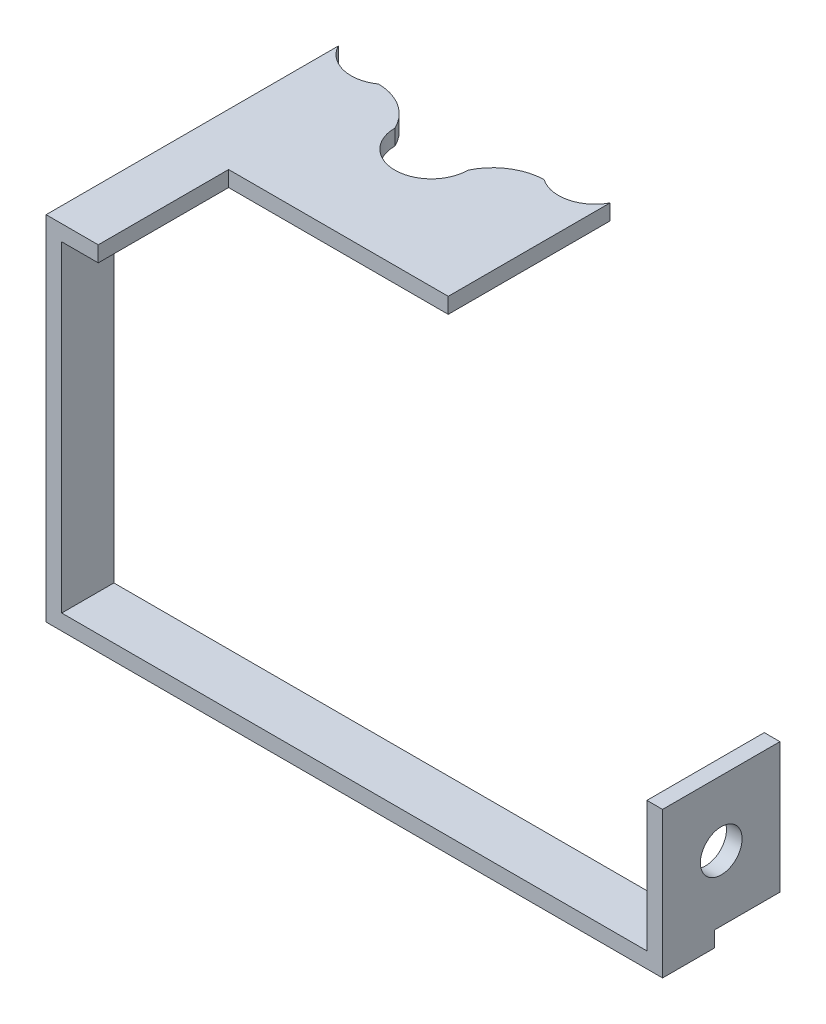
ISO-10303-21;
HEADER;
FILE_DESCRIPTION(('STEP AP214'),'2;1');
FILE_NAME('part.step','',(''),(''),'','','');
FILE_SCHEMA(('AUTOMOTIVE_DESIGN { 1 0 10303 214 1 1 1 1 }'));
ENDSEC;
DATA;
#1=APPLICATION_CONTEXT('core data for automotive mechanical design processes');
#2=APPLICATION_PROTOCOL_DEFINITION('international standard','automotive_design',2000,#1);
#3=PRODUCT_CONTEXT('',#1,'mechanical');
#4=PRODUCT('Part','Part','',(#3));
#5=PRODUCT_RELATED_PRODUCT_CATEGORY('part','',(#4));
#6=PRODUCT_DEFINITION_FORMATION('','',#4);
#7=PRODUCT_DEFINITION_CONTEXT('part definition',#1,'design');
#8=PRODUCT_DEFINITION('design','',#6,#7);
#9=PRODUCT_DEFINITION_SHAPE('','',#8);
#10=(LENGTH_UNIT() NAMED_UNIT(*) SI_UNIT(.MILLI.,.METRE.));
#11=(NAMED_UNIT(*) PLANE_ANGLE_UNIT() SI_UNIT($,.RADIAN.));
#12=(NAMED_UNIT(*) SI_UNIT($,.STERADIAN.) SOLID_ANGLE_UNIT());
#13=UNCERTAINTY_MEASURE_WITH_UNIT(LENGTH_MEASURE(1.E-05),#10,'distance_accuracy_value','');
#14=(GEOMETRIC_REPRESENTATION_CONTEXT(3) GLOBAL_UNCERTAINTY_ASSIGNED_CONTEXT((#13)) GLOBAL_UNIT_ASSIGNED_CONTEXT((#10,
#11,#12)) REPRESENTATION_CONTEXT('',''));
#15=CARTESIAN_POINT('',(0.,0.,0.));
#16=DIRECTION('',(0.,0.,1.));
#17=DIRECTION('',(1.,0.,0.));
#18=AXIS2_PLACEMENT_3D('',#15,#16,#17);
#19=CARTESIAN_POINT('',(92.1564308814646,-61.65,47.8349535593541));
#20=DIRECTION('',(0.,-1.,0.));
#21=DIRECTION('',(0.,0.,-1.));
#22=AXIS2_PLACEMENT_3D('',#19,#20,#21);
#23=PLANE('',#22);
#24=DIRECTION('',(0.,0.,1.));
#25=VECTOR('',#24,1.);
#26=CARTESIAN_POINT('',(89.1564308814646,-61.65,47.8349535593541));
#27=LINE('',#26,#25);
#28=CARTESIAN_POINT('',(89.1564308814646,-61.65,37.8349535593541));
#29=VERTEX_POINT('',#28);
#30=CARTESIAN_POINT('',(89.1564308814646,-61.65,47.8349535593541));
#31=VERTEX_POINT('',#30);
#32=EDGE_CURVE('E366',#29,#31,#27,.T.);
#33=ORIENTED_EDGE('',*,*,#32,.F.);
#34=DIRECTION('',(-1.,0.,0.));
#35=VECTOR('',#34,1.);
#36=CARTESIAN_POINT('',(92.1564308814646,-61.65,37.8349535593541));
#37=LINE('',#36,#35);
#38=CARTESIAN_POINT('',(-23.0555691185354,-61.65,37.8349535593541));
#39=VERTEX_POINT('',#38);
#40=EDGE_CURVE('E211',#29,#39,#37,.T.);
#41=ORIENTED_EDGE('',*,*,#40,.T.);
#42=DIRECTION('',(0.,0.,1.));
#43=VECTOR('',#42,1.);
#44=CARTESIAN_POINT('',(-23.0555691185354,-61.65,47.8349535593541));
#45=LINE('',#44,#43);
#46=CARTESIAN_POINT('',(-23.0555691185354,-61.65,47.8349535593541));
#47=VERTEX_POINT('',#46);
#48=EDGE_CURVE('E195',#39,#47,#45,.T.);
#49=ORIENTED_EDGE('',*,*,#48,.T.);
#50=DIRECTION('',(-1.,0.,0.));
#51=VECTOR('',#50,1.);
#52=CARTESIAN_POINT('',(92.1564308814646,-61.65,47.8349535593541));
#53=LINE('',#52,#51);
#54=EDGE_CURVE('E208',#31,#47,#53,.T.);
#55=ORIENTED_EDGE('',*,*,#54,.F.);
#56=EDGE_LOOP('',(#33,#41,#49,#55));
#57=FACE_BOUND('',#56,.T.);
#58=ADVANCED_FACE('F39',(#57),#23,.F.);
#59=CARTESIAN_POINT('',(-23.0555691185354,-64.65,47.8349535593541));
#60=DIRECTION('',(-1.,0.,0.));
#61=DIRECTION('',(0.,0.,1.));
#62=AXIS2_PLACEMENT_3D('',#59,#60,#61);
#63=PLANE('',#62);
#64=ORIENTED_EDGE('',*,*,#48,.F.);
#65=DIRECTION('',(0.,1.,0.));
#66=VECTOR('',#65,1.);
#67=CARTESIAN_POINT('',(-23.0555691185354,-64.65,37.8349535593541));
#68=LINE('',#67,#66);
#69=CARTESIAN_POINT('',(-23.0555691185354,0.,37.8349535593541));
#70=VERTEX_POINT('',#69);
#71=EDGE_CURVE('E226',#39,#70,#68,.T.);
#72=ORIENTED_EDGE('',*,*,#71,.T.);
#73=DIRECTION('',(0.,0.,1.));
#74=VECTOR('',#73,1.);
#75=CARTESIAN_POINT('',(-23.0555691185354,0.,47.8349535593541));
#76=LINE('',#75,#74);
#77=CARTESIAN_POINT('',(-23.0555691185354,0.,47.8349535593541));
#78=VERTEX_POINT('',#77);
#79=EDGE_CURVE('E218',#70,#78,#76,.T.);
#80=ORIENTED_EDGE('',*,*,#79,.T.);
#81=DIRECTION('',(0.,1.,0.));
#82=VECTOR('',#81,1.);
#83=CARTESIAN_POINT('',(-23.0555691185354,-64.65,47.8349535593541));
#84=LINE('',#83,#82);
#85=EDGE_CURVE('E62',#47,#78,#84,.T.);
#86=ORIENTED_EDGE('',*,*,#85,.F.);
#87=EDGE_LOOP('',(#64,#72,#80,#86));
#88=FACE_BOUND('',#87,.T.);
#89=ADVANCED_FACE('F347',(#88),#63,.F.);
#90=CARTESIAN_POINT('',(16.0451571243017,0.,4.26440295899608));
#91=DIRECTION('',(0.,1.,0.));
#92=DIRECTION('',(0.,0.,1.));
#93=AXIS2_PLACEMENT_3D('',#90,#91,#92);
#94=PLANE('',#93);
#95=ORIENTED_EDGE('',*,*,#79,.F.);
#96=DIRECTION('',(1.,0.,0.));
#97=VECTOR('',#96,1.);
#98=CARTESIAN_POINT('',(-26.0555691185354,0.,37.8349535593541));
#99=LINE('',#98,#97);
#100=CARTESIAN_POINT('',(-26.0555691185354,0.,37.8349535593541));
#101=VERTEX_POINT('',#100);
#102=EDGE_CURVE('E54',#101,#70,#99,.T.);
#103=ORIENTED_EDGE('',*,*,#102,.F.);
#104=DIRECTION('',(0.,0.,1.));
#105=VECTOR('',#104,1.);
#106=CARTESIAN_POINT('',(-26.0555691185354,0.,22.8349535593541));
#107=LINE('',#106,#105);
#108=CARTESIAN_POINT('',(-26.0555691185354,0.,-8.18804644064587));
#109=VERTEX_POINT('',#108);
#110=EDGE_CURVE('E277',#109,#101,#107,.T.);
#111=ORIENTED_EDGE('',*,*,#110,.F.);
#112=CARTESIAN_POINT('',(-19.8752830168529,0.,-11.4749999999999));
#113=DIRECTION('',(0.,-1.,0.));
#114=DIRECTION('',(0.,0.,-1.));
#115=AXIS2_PLACEMENT_3D('',#112,#113,#114);
#116=CIRCLE('',#115,7.);
#117=CARTESIAN_POINT('',(-15.8700792263388,0.,-5.73406431002294));
#118=VERTEX_POINT('',#117);
#119=EDGE_CURVE('E275',#118,#109,#116,.T.);
#120=ORIENTED_EDGE('',*,*,#119,.F.);
#121=CARTESIAN_POINT('',(-16.0451571243017,0.,4.26440295899608));
#122=DIRECTION('',(0.,1.,0.));
#123=DIRECTION('',(0.,0.,1.));
#124=AXIS2_PLACEMENT_3D('',#121,#122,#123);
#125=CIRCLE('',#124,9.99999999999999);
#126=CARTESIAN_POINT('',(-7.,0.,0.));
#127=VERTEX_POINT('',#126);
#128=EDGE_CURVE('E273',#127,#118,#125,.T.);
#129=ORIENTED_EDGE('',*,*,#128,.F.);
#130=CARTESIAN_POINT('',(0.,0.,0.));
#131=DIRECTION('',(0.,-1.,0.));
#132=DIRECTION('',(0.,0.,-1.));
#133=AXIS2_PLACEMENT_3D('',#130,#131,#132);
#134=CIRCLE('',#133,7.);
#135=CARTESIAN_POINT('',(7.,0.,0.));
#136=VERTEX_POINT('',#135);
#137=EDGE_CURVE('E271',#136,#127,#134,.T.);
#138=ORIENTED_EDGE('',*,*,#137,.F.);
#139=CARTESIAN_POINT('',(16.0451571243017,0.,4.26440295899608));
#140=DIRECTION('',(0.,1.,0.));
#141=DIRECTION('',(0.,0.,1.));
#142=AXIS2_PLACEMENT_3D('',#139,#140,#141);
#143=CIRCLE('',#142,10.);
#144=CARTESIAN_POINT('',(15.8700792263388,0.,-5.73406431002295));
#145=VERTEX_POINT('',#144);
#146=EDGE_CURVE('E249',#145,#136,#143,.T.);
#147=ORIENTED_EDGE('',*,*,#146,.F.);
#148=CARTESIAN_POINT('',(19.8752830168529,0.,-11.4749999999999));
#149=DIRECTION('',(0.,-1.,0.));
#150=DIRECTION('',(0.,0.,1.));
#151=AXIS2_PLACEMENT_3D('',#148,#149,#150);
#152=CIRCLE('',#151,7.);
#153=CARTESIAN_POINT('',(26.0555691185354,0.,-8.18804644064582));
#154=VERTEX_POINT('',#153);
#155=EDGE_CURVE('E254',#154,#145,#152,.T.);
#156=ORIENTED_EDGE('',*,*,#155,.F.);
#157=DIRECTION('',(0.,0.,-1.));
#158=VECTOR('',#157,1.);
#159=CARTESIAN_POINT('',(26.0555691185354,0.,-8.18804644064582));
#160=LINE('',#159,#158);
#161=CARTESIAN_POINT('',(26.0555691185354,0.,22.8349535593541));
#162=VERTEX_POINT('',#161);
#163=EDGE_CURVE('E281',#162,#154,#160,.T.);
#164=ORIENTED_EDGE('',*,*,#163,.F.);
#165=DIRECTION('',(1.,0.,0.));
#166=VECTOR('',#165,1.);
#167=CARTESIAN_POINT('',(-26.0555691185354,0.,22.8349535593541));
#168=LINE('',#167,#166);
#169=CARTESIAN_POINT('',(-16.0555691185354,0.,22.8349535593541));
#170=VERTEX_POINT('',#169);
#171=EDGE_CURVE('E279',#170,#162,#168,.T.);
#172=ORIENTED_EDGE('',*,*,#171,.F.);
#173=DIRECTION('',(0.,0.,-1.));
#174=VECTOR('',#173,1.);
#175=CARTESIAN_POINT('',(-16.0555691185354,0.,47.8349535593541));
#176=LINE('',#175,#174);
#177=CARTESIAN_POINT('',(-16.0555691185354,0.,47.8349535593541));
#178=VERTEX_POINT('',#177);
#179=EDGE_CURVE('E246',#178,#170,#176,.T.);
#180=ORIENTED_EDGE('',*,*,#179,.F.);
#181=DIRECTION('',(1.,0.,0.));
#182=VECTOR('',#181,1.);
#183=CARTESIAN_POINT('',(-26.0555691185354,0.,47.8349535593541));
#184=LINE('',#183,#182);
#185=EDGE_CURVE('E237',#78,#178,#184,.T.);
#186=ORIENTED_EDGE('',*,*,#185,.F.);
#187=EDGE_LOOP('',(#95,#103,#111,#120,#129,#138,#147,#156,#164,#172,#180,#186));
#188=FACE_BOUND('',#187,.T.);
#189=ADVANCED_FACE('F306',(#188),#94,.F.);
#190=CARTESIAN_POINT('',(-26.0555691185354,3.,22.8349535593541));
#191=DIRECTION('',(0.,0.,-1.));
#192=DIRECTION('',(-1.,0.,0.));
#193=AXIS2_PLACEMENT_3D('',#190,#191,#192);
#194=PLANE('',#193);
#195=DIRECTION('',(0.,1.,0.));
#196=VECTOR('',#195,1.);
#197=CARTESIAN_POINT('',(-16.0555691185354,3.,22.8349535593541));
#198=LINE('',#197,#196);
#199=CARTESIAN_POINT('',(-16.0555691185354,3.,22.8349535593541));
#200=VERTEX_POINT('',#199);
#201=EDGE_CURVE('E231',#170,#200,#198,.T.);
#202=ORIENTED_EDGE('',*,*,#201,.F.);
#203=ORIENTED_EDGE('',*,*,#171,.T.);
#204=DIRECTION('',(0.,-1.,0.));
#205=VECTOR('',#204,1.);
#206=CARTESIAN_POINT('',(26.0555691185354,3.,22.8349535593541));
#207=LINE('',#206,#205);
#208=CARTESIAN_POINT('',(26.0555691185354,3.,22.8349535593541));
#209=VERTEX_POINT('',#208);
#210=EDGE_CURVE('E289',#209,#162,#207,.T.);
#211=ORIENTED_EDGE('',*,*,#210,.F.);
#212=DIRECTION('',(1.,0.,0.));
#213=VECTOR('',#212,1.);
#214=CARTESIAN_POINT('',(-26.0555691185354,3.,22.8349535593541));
#215=LINE('',#214,#213);
#216=EDGE_CURVE('E262',#200,#209,#215,.T.);
#217=ORIENTED_EDGE('',*,*,#216,.F.);
#218=EDGE_LOOP('',(#202,#203,#211,#217));
#219=FACE_BOUND('',#218,.T.);
#220=ADVANCED_FACE('F338',(#219),#194,.F.);
#221=CARTESIAN_POINT('',(16.0451571243017,3.,4.26440295899608));
#222=DIRECTION('',(0.,-1.,0.));
#223=DIRECTION('',(0.,0.,-1.));
#224=AXIS2_PLACEMENT_3D('',#221,#222,#223);
#225=CYLINDRICAL_SURFACE('',#224,10.);
#226=ORIENTED_EDGE('',*,*,#146,.T.);
#227=DIRECTION('',(0.,-1.,0.));
#228=VECTOR('',#227,1.);
#229=CARTESIAN_POINT('',(7.,3.,0.));
#230=LINE('',#229,#228);
#231=CARTESIAN_POINT('',(7.,3.,0.));
#232=VERTEX_POINT('',#231);
#233=EDGE_CURVE('E11',#232,#136,#230,.T.);
#234=ORIENTED_EDGE('',*,*,#233,.F.);
#235=CARTESIAN_POINT('',(16.0451571243017,3.,4.26440295899608));
#236=DIRECTION('',(0.,1.,0.));
#237=DIRECTION('',(0.,0.,1.));
#238=AXIS2_PLACEMENT_3D('',#235,#236,#237);
#239=CIRCLE('',#238,10.);
#240=CARTESIAN_POINT('',(15.8700792263388,3.,-5.73406431002295));
#241=VERTEX_POINT('',#240);
#242=EDGE_CURVE('E250',#241,#232,#239,.T.);
#243=ORIENTED_EDGE('',*,*,#242,.F.);
#244=DIRECTION('',(0.,-1.,0.));
#245=VECTOR('',#244,1.);
#246=CARTESIAN_POINT('',(15.8700792263388,3.,-5.73406431002295));
#247=LINE('',#246,#245);
#248=EDGE_CURVE('E268',#241,#145,#247,.T.);
#249=ORIENTED_EDGE('',*,*,#248,.T.);
#250=EDGE_LOOP('',(#226,#234,#243,#249));
#251=FACE_BOUND('',#250,.T.);
#252=ADVANCED_FACE('F41',(#251),#225,.T.);
#253=CARTESIAN_POINT('',(0.,3.,0.));
#254=DIRECTION('',(0.,-1.,0.));
#255=DIRECTION('',(0.,0.,-1.));
#256=AXIS2_PLACEMENT_3D('',#253,#254,#255);
#257=CYLINDRICAL_SURFACE('',#256,7.);
#258=ORIENTED_EDGE('',*,*,#137,.T.);
#259=DIRECTION('',(0.,-1.,0.));
#260=VECTOR('',#259,1.);
#261=CARTESIAN_POINT('',(-7.,3.,0.));
#262=LINE('',#261,#260);
#263=CARTESIAN_POINT('',(-7.,3.,0.));
#264=VERTEX_POINT('',#263);
#265=EDGE_CURVE('E47',#264,#127,#262,.T.);
#266=ORIENTED_EDGE('',*,*,#265,.F.);
#267=CARTESIAN_POINT('',(0.,3.,0.));
#268=DIRECTION('',(0.,-1.,0.));
#269=DIRECTION('',(0.,0.,-1.));
#270=AXIS2_PLACEMENT_3D('',#267,#268,#269);
#271=CIRCLE('',#270,7.);
#272=EDGE_CURVE('E253',#232,#264,#271,.T.);
#273=ORIENTED_EDGE('',*,*,#272,.F.);
#274=ORIENTED_EDGE('',*,*,#233,.T.);
#275=EDGE_LOOP('',(#258,#266,#273,#274));
#276=FACE_BOUND('',#275,.T.);
#277=ADVANCED_FACE('F323',(#276),#257,.F.);
#278=CARTESIAN_POINT('',(-16.0451571243017,3.,4.26440295899608));
#279=DIRECTION('',(0.,-1.,0.));
#280=DIRECTION('',(0.,0.,-1.));
#281=AXIS2_PLACEMENT_3D('',#278,#279,#280);
#282=CYLINDRICAL_SURFACE('',#281,9.99999999999999);
#283=ORIENTED_EDGE('',*,*,#128,.T.);
#284=DIRECTION('',(0.,-1.,0.));
#285=VECTOR('',#284,1.);
#286=CARTESIAN_POINT('',(-15.8700792263388,3.,-5.73406431002294));
#287=LINE('',#286,#285);
#288=CARTESIAN_POINT('',(-15.8700792263388,3.,-5.73406431002294));
#289=VERTEX_POINT('',#288);
#290=EDGE_CURVE('E295',#289,#118,#287,.T.);
#291=ORIENTED_EDGE('',*,*,#290,.F.);
#292=CARTESIAN_POINT('',(-16.0451571243017,3.,4.26440295899608));
#293=DIRECTION('',(0.,1.,0.));
#294=DIRECTION('',(0.,0.,1.));
#295=AXIS2_PLACEMENT_3D('',#292,#293,#294);
#296=CIRCLE('',#295,9.99999999999999);
#297=EDGE_CURVE('E256',#264,#289,#296,.T.);
#298=ORIENTED_EDGE('',*,*,#297,.F.);
#299=ORIENTED_EDGE('',*,*,#265,.T.);
#300=EDGE_LOOP('',(#283,#291,#298,#299));
#301=FACE_BOUND('',#300,.T.);
#302=ADVANCED_FACE('F302',(#301),#282,.T.);
#303=CARTESIAN_POINT('',(-19.8752830168529,3.,-11.4749999999999));
#304=DIRECTION('',(0.,-1.,0.));
#305=DIRECTION('',(0.,0.,-1.));
#306=AXIS2_PLACEMENT_3D('',#303,#304,#305);
#307=CYLINDRICAL_SURFACE('',#306,7.);
#308=ORIENTED_EDGE('',*,*,#119,.T.);
#309=DIRECTION('',(0.,-1.,0.));
#310=VECTOR('',#309,1.);
#311=CARTESIAN_POINT('',(-26.0555691185354,3.,-8.18804644064587));
#312=LINE('',#311,#310);
#313=CARTESIAN_POINT('',(-26.0555691185354,3.,-8.18804644064587));
#314=VERTEX_POINT('',#313);
#315=EDGE_CURVE('E292',#314,#109,#312,.T.);
#316=ORIENTED_EDGE('',*,*,#315,.F.);
#317=CARTESIAN_POINT('',(-19.8752830168529,3.,-11.4749999999999));
#318=DIRECTION('',(0.,-1.,0.));
#319=DIRECTION('',(0.,0.,-1.));
#320=AXIS2_PLACEMENT_3D('',#317,#318,#319);
#321=CIRCLE('',#320,7.);
#322=EDGE_CURVE('E258',#289,#314,#321,.T.);
#323=ORIENTED_EDGE('',*,*,#322,.F.);
#324=ORIENTED_EDGE('',*,*,#290,.T.);
#325=EDGE_LOOP('',(#308,#316,#323,#324));
#326=FACE_BOUND('',#325,.T.);
#327=ADVANCED_FACE('F310',(#326),#307,.F.);
#328=CARTESIAN_POINT('',(-26.0555691185354,3.,22.8349535593541));
#329=DIRECTION('',(1.,0.,0.));
#330=DIRECTION('',(0.,0.,-1.));
#331=AXIS2_PLACEMENT_3D('',#328,#329,#330);
#332=PLANE('',#331);
#333=ORIENTED_EDGE('',*,*,#110,.T.);
#334=DIRECTION('',(0.,1.,0.));
#335=VECTOR('',#334,1.);
#336=CARTESIAN_POINT('',(-26.0555691185354,-64.65,37.8349535593541));
#337=LINE('',#336,#335);
#338=CARTESIAN_POINT('',(-26.0555691185354,-64.65,37.8349535593541));
#339=VERTEX_POINT('',#338);
#340=EDGE_CURVE('E228',#339,#101,#337,.T.);
#341=ORIENTED_EDGE('',*,*,#340,.F.);
#342=DIRECTION('',(0.,0.,-1.));
#343=VECTOR('',#342,1.);
#344=CARTESIAN_POINT('',(-26.0555691185354,-64.65,47.8349535593541));
#345=LINE('',#344,#343);
#346=CARTESIAN_POINT('',(-26.0555691185354,-64.65,47.8349535593541));
#347=VERTEX_POINT('',#346);
#348=EDGE_CURVE('E217',#347,#339,#345,.T.);
#349=ORIENTED_EDGE('',*,*,#348,.F.);
#350=DIRECTION('',(0.,-1.,0.));
#351=VECTOR('',#350,1.);
#352=CARTESIAN_POINT('',(-26.0555691185354,3.,47.8349535593541));
#353=LINE('',#352,#351);
#354=CARTESIAN_POINT('',(-26.0555691185354,3.,47.8349535593541));
#355=VERTEX_POINT('',#354);
#356=EDGE_CURVE('E235',#355,#347,#353,.T.);
#357=ORIENTED_EDGE('',*,*,#356,.F.);
#358=DIRECTION('',(0.,0.,1.));
#359=VECTOR('',#358,1.);
#360=CARTESIAN_POINT('',(-26.0555691185354,3.,22.8349535593541));
#361=LINE('',#360,#359);
#362=EDGE_CURVE('E260',#314,#355,#361,.T.);
#363=ORIENTED_EDGE('',*,*,#362,.F.);
#364=ORIENTED_EDGE('',*,*,#315,.T.);
#365=EDGE_LOOP('',(#333,#341,#349,#357,#363,#364));
#366=FACE_BOUND('',#365,.T.);
#367=ADVANCED_FACE('F314',(#366),#332,.F.);
#368=CARTESIAN_POINT('',(26.0555691185354,3.,-8.18804644064582));
#369=DIRECTION('',(-1.,0.,0.));
#370=DIRECTION('',(0.,0.,1.));
#371=AXIS2_PLACEMENT_3D('',#368,#369,#370);
#372=PLANE('',#371);
#373=ORIENTED_EDGE('',*,*,#163,.T.);
#374=DIRECTION('',(0.,-1.,0.));
#375=VECTOR('',#374,1.);
#376=CARTESIAN_POINT('',(26.0555691185354,3.,-8.18804644064582));
#377=LINE('',#376,#375);
#378=CARTESIAN_POINT('',(26.0555691185354,3.,-8.18804644064582));
#379=VERTEX_POINT('',#378);
#380=EDGE_CURVE('E286',#379,#154,#377,.T.);
#381=ORIENTED_EDGE('',*,*,#380,.F.);
#382=DIRECTION('',(0.,0.,-1.));
#383=VECTOR('',#382,1.);
#384=CARTESIAN_POINT('',(26.0555691185354,3.,-8.18804644064582));
#385=LINE('',#384,#383);
#386=EDGE_CURVE('E264',#209,#379,#385,.T.);
#387=ORIENTED_EDGE('',*,*,#386,.F.);
#388=ORIENTED_EDGE('',*,*,#210,.T.);
#389=EDGE_LOOP('',(#373,#381,#387,#388));
#390=FACE_BOUND('',#389,.T.);
#391=ADVANCED_FACE('F335',(#390),#372,.F.);
#392=CARTESIAN_POINT('',(19.8752830168529,3.,-11.4749999999999));
#393=DIRECTION('',(0.,-1.,0.));
#394=DIRECTION('',(0.,0.,-1.));
#395=AXIS2_PLACEMENT_3D('',#392,#393,#394);
#396=CYLINDRICAL_SURFACE('',#395,7.);
#397=ORIENTED_EDGE('',*,*,#155,.T.);
#398=ORIENTED_EDGE('',*,*,#248,.F.);
#399=CARTESIAN_POINT('',(19.8752830168529,3.,-11.4749999999999));
#400=DIRECTION('',(0.,-1.,0.));
#401=DIRECTION('',(0.,0.,1.));
#402=AXIS2_PLACEMENT_3D('',#399,#400,#401);
#403=CIRCLE('',#402,7.);
#404=EDGE_CURVE('E266',#379,#241,#403,.T.);
#405=ORIENTED_EDGE('',*,*,#404,.F.);
#406=ORIENTED_EDGE('',*,*,#380,.T.);
#407=EDGE_LOOP('',(#397,#398,#405,#406));
#408=FACE_BOUND('',#407,.T.);
#409=ADVANCED_FACE('F330',(#408),#396,.F.);
#410=CARTESIAN_POINT('',(16.0451571243017,3.,4.26440295899608));
#411=DIRECTION('',(0.,1.,0.));
#412=DIRECTION('',(0.,0.,1.));
#413=AXIS2_PLACEMENT_3D('',#410,#411,#412);
#414=PLANE('',#413);
#415=ORIENTED_EDGE('',*,*,#242,.T.);
#416=ORIENTED_EDGE('',*,*,#272,.T.);
#417=ORIENTED_EDGE('',*,*,#297,.T.);
#418=ORIENTED_EDGE('',*,*,#322,.T.);
#419=ORIENTED_EDGE('',*,*,#362,.T.);
#420=DIRECTION('',(-1.,0.,0.));
#421=VECTOR('',#420,1.);
#422=CARTESIAN_POINT('',(-26.0555691185354,3.,47.8349535593541));
#423=LINE('',#422,#421);
#424=CARTESIAN_POINT('',(-16.0555691185354,3.,47.8349535593541));
#425=VERTEX_POINT('',#424);
#426=EDGE_CURVE('E232',#425,#355,#423,.T.);
#427=ORIENTED_EDGE('',*,*,#426,.F.);
#428=DIRECTION('',(0.,0.,-1.));
#429=VECTOR('',#428,1.);
#430=CARTESIAN_POINT('',(-16.0555691185354,3.,47.8349535593541));
#431=LINE('',#430,#429);
#432=EDGE_CURVE('E241',#425,#200,#431,.T.);
#433=ORIENTED_EDGE('',*,*,#432,.T.);
#434=ORIENTED_EDGE('',*,*,#216,.T.);
#435=ORIENTED_EDGE('',*,*,#386,.T.);
#436=ORIENTED_EDGE('',*,*,#404,.T.);
#437=EDGE_LOOP('',(#415,#416,#417,#418,#419,#427,#433,#434,#435,#436));
#438=FACE_BOUND('',#437,.T.);
#439=ADVANCED_FACE('F320',(#438),#414,.T.);
#440=CARTESIAN_POINT('',(-16.0555691185354,3.,47.8349535593541));
#441=DIRECTION('',(-1.,0.,0.));
#442=DIRECTION('',(0.,0.,1.));
#443=AXIS2_PLACEMENT_3D('',#440,#441,#442);
#444=PLANE('',#443);
#445=ORIENTED_EDGE('',*,*,#201,.T.);
#446=ORIENTED_EDGE('',*,*,#432,.F.);
#447=DIRECTION('',(0.,1.,0.));
#448=VECTOR('',#447,1.);
#449=CARTESIAN_POINT('',(-16.0555691185354,3.,47.8349535593541));
#450=LINE('',#449,#448);
#451=EDGE_CURVE('E239',#178,#425,#450,.T.);
#452=ORIENTED_EDGE('',*,*,#451,.F.);
#453=ORIENTED_EDGE('',*,*,#179,.T.);
#454=EDGE_LOOP('',(#445,#446,#452,#453));
#455=FACE_BOUND('',#454,.T.);
#456=ADVANCED_FACE('F342',(#455),#444,.F.);
#457=CARTESIAN_POINT('',(0.,0.,47.8349535593541));
#458=DIRECTION('',(0.,0.,-1.));
#459=DIRECTION('',(-1.,0.,0.));
#460=AXIS2_PLACEMENT_3D('',#457,#458,#459);
#461=PLANE('',#460);
#462=ORIENTED_EDGE('',*,*,#426,.T.);
#463=ORIENTED_EDGE('',*,*,#356,.T.);
#464=DIRECTION('',(-1.,0.,0.));
#465=VECTOR('',#464,1.);
#466=CARTESIAN_POINT('',(-26.0555691185354,-64.65,47.8349535593541));
#467=LINE('',#466,#465);
#468=CARTESIAN_POINT('',(92.1564308814646,-64.65,47.8349535593541));
#469=VERTEX_POINT('',#468);
#470=EDGE_CURVE('E214',#469,#347,#467,.T.);
#471=ORIENTED_EDGE('',*,*,#470,.F.);
#472=DIRECTION('',(0.,-1.,0.));
#473=VECTOR('',#472,1.);
#474=CARTESIAN_POINT('',(92.1564308814646,-64.65,47.8349535593541));
#475=LINE('',#474,#473);
#476=CARTESIAN_POINT('',(92.1564308814646,-36.65,47.8349535593541));
#477=VERTEX_POINT('',#476);
#478=EDGE_CURVE('E207',#477,#469,#475,.T.);
#479=ORIENTED_EDGE('',*,*,#478,.F.);
#480=DIRECTION('',(1.,0.,0.));
#481=VECTOR('',#480,1.);
#482=CARTESIAN_POINT('',(92.1564308814646,-36.65,47.8349535593541));
#483=LINE('',#482,#481);
#484=CARTESIAN_POINT('',(89.1564308814646,-36.65,47.8349535593541));
#485=VERTEX_POINT('',#484);
#486=EDGE_CURVE('E185',#485,#477,#483,.T.);
#487=ORIENTED_EDGE('',*,*,#486,.F.);
#488=DIRECTION('',(0.,-1.,0.));
#489=VECTOR('',#488,1.);
#490=CARTESIAN_POINT('',(89.1564308814646,-36.65,47.8349535593541));
#491=LINE('',#490,#489);
#492=EDGE_CURVE('E200',#485,#31,#491,.T.);
#493=ORIENTED_EDGE('',*,*,#492,.T.);
#494=ORIENTED_EDGE('',*,*,#54,.T.);
#495=ORIENTED_EDGE('',*,*,#85,.T.);
#496=ORIENTED_EDGE('',*,*,#185,.T.);
#497=ORIENTED_EDGE('',*,*,#451,.T.);
#498=EDGE_LOOP('',(#462,#463,#471,#479,#487,#493,#494,#495,#496,#497));
#499=FACE_BOUND('',#498,.T.);
#500=ADVANCED_FACE('F344',(#499),#461,.F.);
#501=CARTESIAN_POINT('',(-26.0555691185354,-64.65,37.8349535593541));
#502=DIRECTION('',(0.,0.,1.));
#503=DIRECTION('',(1.,0.,0.));
#504=AXIS2_PLACEMENT_3D('',#501,#502,#503);
#505=PLANE('',#504);
#506=ORIENTED_EDGE('',*,*,#102,.T.);
#507=ORIENTED_EDGE('',*,*,#71,.F.);
#508=ORIENTED_EDGE('',*,*,#40,.F.);
#509=CARTESIAN_POINT('',(92.1564308814646,-61.65,37.8349535593541));
#510=VERTEX_POINT('',#509);
#511=EDGE_CURVE('E212',#510,#29,#37,.T.);
#512=ORIENTED_EDGE('',*,*,#511,.F.);
#513=DIRECTION('',(0.,1.,0.));
#514=VECTOR('',#513,1.);
#515=CARTESIAN_POINT('',(92.1564308814646,-64.65,37.8349535593541));
#516=LINE('',#515,#514);
#517=CARTESIAN_POINT('',(92.1564308814646,-64.65,37.8349535593541));
#518=VERTEX_POINT('',#517);
#519=EDGE_CURVE('E205',#518,#510,#516,.T.);
#520=ORIENTED_EDGE('',*,*,#519,.F.);
#521=DIRECTION('',(1.,0.,0.));
#522=VECTOR('',#521,1.);
#523=CARTESIAN_POINT('',(-26.0555691185354,-64.65,37.8349535593541));
#524=LINE('',#523,#522);
#525=EDGE_CURVE('E220',#339,#518,#524,.T.);
#526=ORIENTED_EDGE('',*,*,#525,.F.);
#527=ORIENTED_EDGE('',*,*,#340,.T.);
#528=EDGE_LOOP('',(#506,#507,#508,#512,#520,#526,#527));
#529=FACE_BOUND('',#528,.T.);
#530=ADVANCED_FACE('F351',(#529),#505,.F.);
#531=CARTESIAN_POINT('',(0.,-64.65,0.));
#532=DIRECTION('',(0.,1.,0.));
#533=DIRECTION('',(0.,0.,1.));
#534=AXIS2_PLACEMENT_3D('',#531,#532,#533);
#535=PLANE('',#534);
#536=ORIENTED_EDGE('',*,*,#470,.T.);
#537=ORIENTED_EDGE('',*,*,#348,.T.);
#538=ORIENTED_EDGE('',*,*,#525,.T.);
#539=DIRECTION('',(0.,0.,-1.));
#540=VECTOR('',#539,1.);
#541=CARTESIAN_POINT('',(92.1564308814646,-64.65,47.8349535593541));
#542=LINE('',#541,#540);
#543=EDGE_CURVE('E198',#469,#518,#542,.T.);
#544=ORIENTED_EDGE('',*,*,#543,.F.);
#545=EDGE_LOOP('',(#536,#537,#538,#544));
#546=FACE_BOUND('',#545,.T.);
#547=ADVANCED_FACE('F357',(#546),#535,.F.);
#548=CARTESIAN_POINT('',(92.1564308814646,0.,0.));
#549=DIRECTION('',(1.,0.,0.));
#550=DIRECTION('',(0.,0.,-1.));
#551=AXIS2_PLACEMENT_3D('',#548,#549,#550);
#552=PLANE('',#551);
#553=CARTESIAN_POINT('',(92.1564308814646,-49.15,36.5849535593541));
#554=DIRECTION('',(1.,0.,0.));
#555=DIRECTION('',(0.,0.,-1.));
#556=AXIS2_PLACEMENT_3D('',#553,#554,#555);
#557=CIRCLE('',#556,4.);
#558=CARTESIAN_POINT('',(92.1564308814646,-49.15,32.5849535593541));
#559=VERTEX_POINT('',#558);
#560=EDGE_CURVE('E378',#559,#559,#557,.T.);
#561=ORIENTED_EDGE('',*,*,#560,.F.);
#562=EDGE_LOOP('',(#561));
#563=FACE_BOUND('',#562,.T.);
#564=ORIENTED_EDGE('',*,*,#543,.T.);
#565=ORIENTED_EDGE('',*,*,#519,.T.);
#566=DIRECTION('',(0.,0.,-1.));
#567=VECTOR('',#566,1.);
#568=CARTESIAN_POINT('',(92.1564308814646,-61.65,47.8349535593541));
#569=LINE('',#568,#567);
#570=CARTESIAN_POINT('',(92.1564308814646,-61.65,25.3349535593541));
#571=VERTEX_POINT('',#570);
#572=EDGE_CURVE('E193',#510,#571,#569,.T.);
#573=ORIENTED_EDGE('',*,*,#572,.T.);
#574=DIRECTION('',(0.,-1.,0.));
#575=VECTOR('',#574,1.);
#576=CARTESIAN_POINT('',(92.1564308814646,-36.65,25.3349535593541));
#577=LINE('',#576,#575);
#578=CARTESIAN_POINT('',(92.1564308814646,-36.65,25.3349535593541));
#579=VERTEX_POINT('',#578);
#580=EDGE_CURVE('E173',#579,#571,#577,.T.);
#581=ORIENTED_EDGE('',*,*,#580,.F.);
#582=DIRECTION('',(0.,0.,-1.));
#583=VECTOR('',#582,1.);
#584=CARTESIAN_POINT('',(92.1564308814646,-36.65,47.8349535593541));
#585=LINE('',#584,#583);
#586=EDGE_CURVE('E179',#477,#579,#585,.T.);
#587=ORIENTED_EDGE('',*,*,#586,.F.);
#588=ORIENTED_EDGE('',*,*,#478,.T.);
#589=EDGE_LOOP('',(#564,#565,#573,#581,#587,#588));
#590=FACE_BOUND('',#589,.T.);
#591=ADVANCED_FACE('F191',(#563,#590),#552,.T.);
#592=CARTESIAN_POINT('',(0.,-61.65,0.));
#593=DIRECTION('',(0.,1.,0.));
#594=DIRECTION('',(0.,0.,1.));
#595=AXIS2_PLACEMENT_3D('',#592,#593,#594);
#596=PLANE('',#595);
#597=ORIENTED_EDGE('',*,*,#572,.F.);
#598=ORIENTED_EDGE('',*,*,#511,.T.);
#599=CARTESIAN_POINT('',(89.1564308814645,-61.65,25.3349535593541));
#600=VERTEX_POINT('',#599);
#601=EDGE_CURVE('E188',#600,#29,#27,.T.);
#602=ORIENTED_EDGE('',*,*,#601,.F.);
#603=DIRECTION('',(-1.,0.,0.));
#604=VECTOR('',#603,1.);
#605=CARTESIAN_POINT('',(92.1564308814646,-61.65,25.3349535593541));
#606=LINE('',#605,#604);
#607=EDGE_CURVE('E371',#571,#600,#606,.T.);
#608=ORIENTED_EDGE('',*,*,#607,.F.);
#609=EDGE_LOOP('',(#597,#598,#602,#608));
#610=FACE_BOUND('',#609,.T.);
#611=ADVANCED_FACE('F361',(#610),#596,.F.);
#612=CARTESIAN_POINT('',(92.1564308814646,-36.65,25.3349535593541));
#613=DIRECTION('',(0.,0.,1.));
#614=DIRECTION('',(1.,0.,0.));
#615=AXIS2_PLACEMENT_3D('',#612,#613,#614);
#616=PLANE('',#615);
#617=ORIENTED_EDGE('',*,*,#607,.T.);
#618=DIRECTION('',(0.,-1.,0.));
#619=VECTOR('',#618,1.);
#620=CARTESIAN_POINT('',(89.1564308814645,-36.65,25.3349535593541));
#621=LINE('',#620,#619);
#622=CARTESIAN_POINT('',(89.1564308814645,-36.65,25.3349535593541));
#623=VERTEX_POINT('',#622);
#624=EDGE_CURVE('E175',#623,#600,#621,.T.);
#625=ORIENTED_EDGE('',*,*,#624,.F.);
#626=DIRECTION('',(-1.,0.,0.));
#627=VECTOR('',#626,1.);
#628=CARTESIAN_POINT('',(92.1564308814646,-36.65,25.3349535593541));
#629=LINE('',#628,#627);
#630=EDGE_CURVE('E169',#579,#623,#629,.T.);
#631=ORIENTED_EDGE('',*,*,#630,.F.);
#632=ORIENTED_EDGE('',*,*,#580,.T.);
#633=EDGE_LOOP('',(#617,#625,#631,#632));
#634=FACE_BOUND('',#633,.T.);
#635=ADVANCED_FACE('F171',(#634),#616,.F.);
#636=CARTESIAN_POINT('',(89.1564308814646,-36.65,47.8349535593541));
#637=DIRECTION('',(1.,0.,0.));
#638=DIRECTION('',(0.,0.,-1.));
#639=AXIS2_PLACEMENT_3D('',#636,#637,#638);
#640=PLANE('',#639);
#641=CARTESIAN_POINT('',(89.1564308814645,-49.15,36.5849535593541));
#642=DIRECTION('',(1.,0.,0.));
#643=DIRECTION('',(0.,0.,-1.));
#644=AXIS2_PLACEMENT_3D('',#641,#642,#643);
#645=CIRCLE('',#644,4.);
#646=CARTESIAN_POINT('',(89.1564308814645,-49.15,32.5849535593541));
#647=VERTEX_POINT('',#646);
#648=EDGE_CURVE('E376',#647,#647,#645,.F.);
#649=ORIENTED_EDGE('',*,*,#648,.F.);
#650=EDGE_LOOP('',(#649));
#651=FACE_BOUND('',#650,.T.);
#652=ORIENTED_EDGE('',*,*,#601,.T.);
#653=ORIENTED_EDGE('',*,*,#32,.T.);
#654=ORIENTED_EDGE('',*,*,#492,.F.);
#655=DIRECTION('',(0.,0.,1.));
#656=VECTOR('',#655,1.);
#657=CARTESIAN_POINT('',(89.1564308814646,-36.65,47.8349535593541));
#658=LINE('',#657,#656);
#659=EDGE_CURVE('E178',#623,#485,#658,.T.);
#660=ORIENTED_EDGE('',*,*,#659,.F.);
#661=ORIENTED_EDGE('',*,*,#624,.T.);
#662=EDGE_LOOP('',(#652,#653,#654,#660,#661));
#663=FACE_BOUND('',#662,.T.);
#664=ADVANCED_FACE('F364',(#651,#663),#640,.F.);
#665=CARTESIAN_POINT('',(0.,-36.65,0.));
#666=DIRECTION('',(0.,1.,0.));
#667=DIRECTION('',(0.,0.,1.));
#668=AXIS2_PLACEMENT_3D('',#665,#666,#667);
#669=PLANE('',#668);
#670=ORIENTED_EDGE('',*,*,#586,.T.);
#671=ORIENTED_EDGE('',*,*,#630,.T.);
#672=ORIENTED_EDGE('',*,*,#659,.T.);
#673=ORIENTED_EDGE('',*,*,#486,.T.);
#674=EDGE_LOOP('',(#670,#671,#672,#673));
#675=FACE_BOUND('',#674,.T.);
#676=ADVANCED_FACE('F183',(#675),#669,.T.);
#677=CARTESIAN_POINT('',(77.8427223824798,-49.15,36.5849535593541));
#678=DIRECTION('',(1.,0.,0.));
#679=DIRECTION('',(0.,0.,-1.));
#680=AXIS2_PLACEMENT_3D('',#677,#678,#679);
#681=CYLINDRICAL_SURFACE('',#680,4.);
#682=ORIENTED_EDGE('',*,*,#648,.T.);
#683=EDGE_LOOP('',(#682));
#684=FACE_BOUND('',#683,.T.);
#685=ORIENTED_EDGE('',*,*,#560,.T.);
#686=EDGE_LOOP('',(#685));
#687=FACE_BOUND('',#686,.T.);
#688=ADVANCED_FACE('F386',(#684,#687),#681,.F.);
#689=CLOSED_SHELL('',(#58,#89,#189,#220,#252,#277,#302,#327,#367,#391,#409,#439,#456,#500,#530,
#547,#591,#611,#635,#664,#676,#688));
#690=MANIFOLD_SOLID_BREP('B2',#689);
#691=ADVANCED_BREP_SHAPE_REPRESENTATION('',(#18,#690),#14);
#692=SHAPE_DEFINITION_REPRESENTATION(#9,#691);
ENDSEC;
END-ISO-10303-21;
